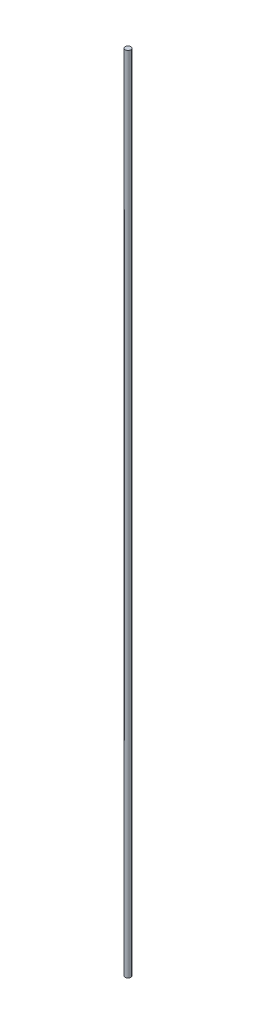
ISO-10303-21;
HEADER;
FILE_DESCRIPTION(('STEP AP214'),'2;1');
FILE_NAME('part.step','',(''),(''),'','','');
FILE_SCHEMA(('AUTOMOTIVE_DESIGN { 1 0 10303 214 1 1 1 1 }'));
ENDSEC;
DATA;
#1=APPLICATION_CONTEXT('core data for automotive mechanical design processes');
#2=APPLICATION_PROTOCOL_DEFINITION('international standard','automotive_design',2000,#1);
#3=PRODUCT_CONTEXT('',#1,'mechanical');
#4=PRODUCT('Part','Part','',(#3));
#5=PRODUCT_RELATED_PRODUCT_CATEGORY('part','',(#4));
#6=PRODUCT_DEFINITION_FORMATION('','',#4);
#7=PRODUCT_DEFINITION_CONTEXT('part definition',#1,'design');
#8=PRODUCT_DEFINITION('design','',#6,#7);
#9=PRODUCT_DEFINITION_SHAPE('','',#8);
#10=(LENGTH_UNIT() NAMED_UNIT(*) SI_UNIT(.MILLI.,.METRE.));
#11=(NAMED_UNIT(*) PLANE_ANGLE_UNIT() SI_UNIT($,.RADIAN.));
#12=(NAMED_UNIT(*) SI_UNIT($,.STERADIAN.) SOLID_ANGLE_UNIT());
#13=UNCERTAINTY_MEASURE_WITH_UNIT(LENGTH_MEASURE(1.E-05),#10,'distance_accuracy_value','');
#14=(GEOMETRIC_REPRESENTATION_CONTEXT(3) GLOBAL_UNCERTAINTY_ASSIGNED_CONTEXT((#13)) GLOBAL_UNIT_ASSIGNED_CONTEXT((#10,
#11,#12)) REPRESENTATION_CONTEXT('',''));
#15=CARTESIAN_POINT('',(0.,0.,0.));
#16=DIRECTION('',(0.,0.,1.));
#17=DIRECTION('',(1.,0.,0.));
#18=AXIS2_PLACEMENT_3D('',#15,#16,#17);
#19=CARTESIAN_POINT('',(0.,-1.,0.));
#20=DIRECTION('',(0.,1.,0.));
#21=DIRECTION('',(0.,0.,1.));
#22=AXIS2_PLACEMENT_3D('',#19,#20,#21);
#23=PLANE('',#22);
#24=CARTESIAN_POINT('',(0.,-1.,0.));
#25=DIRECTION('',(0.,-1.,0.));
#26=DIRECTION('',(0.,0.,-1.));
#27=AXIS2_PLACEMENT_3D('',#24,#25,#26);
#28=CIRCLE('',#27,0.75);
#29=CARTESIAN_POINT('',(0.,-1.,-0.75));
#30=VERTEX_POINT('',#29);
#31=EDGE_CURVE('E10',#30,#30,#28,.T.);
#32=ORIENTED_EDGE('',*,*,#31,.F.);
#33=EDGE_LOOP('',(#32));
#34=FACE_BOUND('',#33,.T.);
#35=ADVANCED_FACE('F31',(#34),#23,.T.);
#36=CARTESIAN_POINT('',(0.,-224.,0.));
#37=DIRECTION('',(0.,-1.,0.));
#38=DIRECTION('',(0.,0.,-1.));
#39=AXIS2_PLACEMENT_3D('',#36,#37,#38);
#40=CYLINDRICAL_SURFACE('',#39,0.75);
#41=ORIENTED_EDGE('',*,*,#31,.T.);
#42=EDGE_LOOP('',(#41));
#43=FACE_BOUND('',#42,.T.);
#44=CARTESIAN_POINT('',(0.,-220.,0.));
#45=DIRECTION('',(0.,-1.,0.));
#46=DIRECTION('',(0.,0.,-1.));
#47=AXIS2_PLACEMENT_3D('',#44,#45,#46);
#48=CIRCLE('',#47,0.75);
#49=CARTESIAN_POINT('',(0.,-220.,-0.75));
#50=VERTEX_POINT('',#49);
#51=EDGE_CURVE('E37',#50,#50,#48,.T.);
#52=ORIENTED_EDGE('',*,*,#51,.F.);
#53=EDGE_LOOP('',(#52));
#54=FACE_BOUND('',#53,.T.);
#55=ADVANCED_FACE('F45',(#43,#54),#40,.T.);
#56=CARTESIAN_POINT('',(0.75,-220.,0.));
#57=DIRECTION('',(0.,-1.,0.));
#58=DIRECTION('',(0.,0.,-1.));
#59=AXIS2_PLACEMENT_3D('',#56,#57,#58);
#60=PLANE('',#59);
#61=ORIENTED_EDGE('',*,*,#51,.T.);
#62=EDGE_LOOP('',(#61));
#63=FACE_BOUND('',#62,.T.);
#64=ADVANCED_FACE('F43',(#63),#60,.T.);
#65=CLOSED_SHELL('',(#35,#55,#64));
#66=MANIFOLD_SOLID_BREP('B2',#65);
#67=ADVANCED_BREP_SHAPE_REPRESENTATION('',(#18,#66),#14);
#68=SHAPE_DEFINITION_REPRESENTATION(#9,#67);
ENDSEC;
END-ISO-10303-21;
